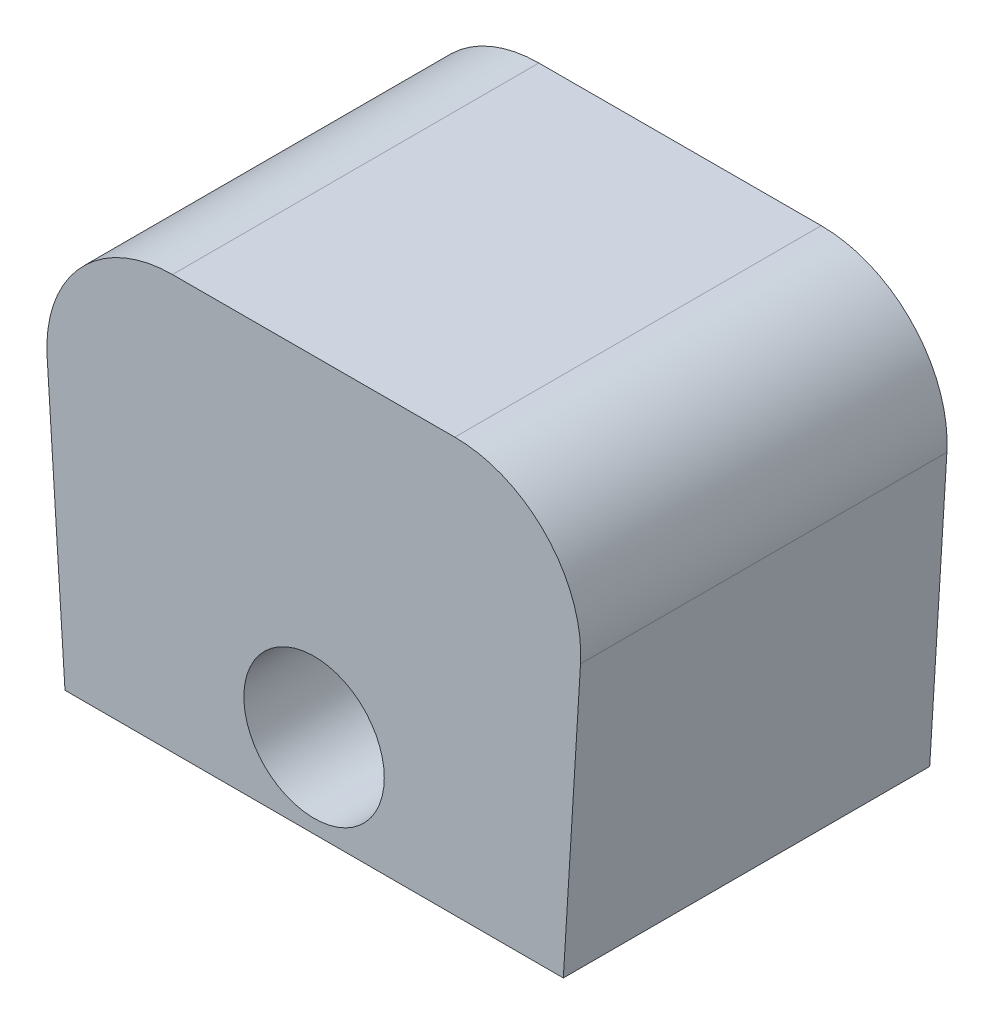
ISO-10303-21;
HEADER;
FILE_DESCRIPTION(('STEP AP214'),'2;1');
FILE_NAME('part.step','',(''),(''),'','','');
FILE_SCHEMA(('AUTOMOTIVE_DESIGN { 1 0 10303 214 1 1 1 1 }'));
ENDSEC;
DATA;
#1=APPLICATION_CONTEXT('core data for automotive mechanical design processes');
#2=APPLICATION_PROTOCOL_DEFINITION('international standard','automotive_design',2000,#1);
#3=PRODUCT_CONTEXT('',#1,'mechanical');
#4=PRODUCT('Part','Part','',(#3));
#5=PRODUCT_RELATED_PRODUCT_CATEGORY('part','',(#4));
#6=PRODUCT_DEFINITION_FORMATION('','',#4);
#7=PRODUCT_DEFINITION_CONTEXT('part definition',#1,'design');
#8=PRODUCT_DEFINITION('design','',#6,#7);
#9=PRODUCT_DEFINITION_SHAPE('','',#8);
#10=(LENGTH_UNIT() NAMED_UNIT(*) SI_UNIT(.MILLI.,.METRE.));
#11=(NAMED_UNIT(*) PLANE_ANGLE_UNIT() SI_UNIT($,.RADIAN.));
#12=(NAMED_UNIT(*) SI_UNIT($,.STERADIAN.) SOLID_ANGLE_UNIT());
#13=UNCERTAINTY_MEASURE_WITH_UNIT(LENGTH_MEASURE(1.E-05),#10,'distance_accuracy_value','');
#14=(GEOMETRIC_REPRESENTATION_CONTEXT(3) GLOBAL_UNCERTAINTY_ASSIGNED_CONTEXT((#13)) GLOBAL_UNIT_ASSIGNED_CONTEXT((#10,
#11,#12)) REPRESENTATION_CONTEXT('',''));
#15=CARTESIAN_POINT('',(0.,0.,0.));
#16=DIRECTION('',(0.,0.,1.));
#17=DIRECTION('',(1.,0.,0.));
#18=AXIS2_PLACEMENT_3D('',#15,#16,#17);
#19=CARTESIAN_POINT('',(-11.3824033916245,-170.017115375092,11.0998));
#20=DIRECTION('',(0.,0.,1.));
#21=DIRECTION('',(1.,0.,0.));
#22=AXIS2_PLACEMENT_3D('',#19,#20,#21);
#23=PLANE('',#22);
#24=DIRECTION('',(-1.,0.,0.));
#25=VECTOR('',#24,1.);
#26=CARTESIAN_POINT('',(-21.7956471497427,-150.96849439695,11.0998));
#27=LINE('',#26,#25);
#28=CARTESIAN_POINT('',(-3.85789011624694,-150.96849439695,11.0998));
#29=VERTEX_POINT('',#28);
#30=CARTESIAN_POINT('',(-18.9554243105865,-150.96849439695,11.0998));
#31=VERTEX_POINT('',#30);
#32=EDGE_CURVE('E55',#29,#31,#27,.T.);
#33=ORIENTED_EDGE('',*,*,#32,.F.);
#34=DIRECTION('',(0.0611381739078937,0.998129312109011,0.));
#35=VECTOR('',#34,1.);
#36=CARTESIAN_POINT('',(-5.03224485190564,-170.140769418459,11.0998));
#37=LINE('',#36,#35);
#38=CARTESIAN_POINT('',(-3.33703395668933,-142.465103356351,11.0998));
#39=VERTEX_POINT('',#38);
#40=EDGE_CURVE('E90',#29,#39,#37,.T.);
#41=ORIENTED_EDGE('',*,*,#40,.T.);
#42=CARTESIAN_POINT('',(-7.13990663582466,-142.232166913762,11.0998));
#43=DIRECTION('',(0.,0.,1.));
#44=DIRECTION('',(1.,0.,0.));
#45=AXIS2_PLACEMENT_3D('',#42,#43,#44);
#46=CIRCLE('',#45,3.81);
#47=CARTESIAN_POINT('',(-7.14464049886683,-138.422169854637,11.0998));
#48=VERTEX_POINT('',#47);
#49=EDGE_CURVE('E116',#39,#48,#46,.T.);
#50=ORIENTED_EDGE('',*,*,#49,.T.);
#51=DIRECTION('',(-0.999999228116782,-0.00124248373809783,0.));
#52=VECTOR('',#51,1.);
#53=CARTESIAN_POINT('',(-7.14464049886683,-138.422169854637,11.0998));
#54=LINE('',#53,#52);
#55=CARTESIAN_POINT('',(-15.6986655515832,-138.432798099864,11.0998));
#56=VERTEX_POINT('',#55);
#57=EDGE_CURVE('E121',#48,#56,#54,.T.);
#58=ORIENTED_EDGE('',*,*,#57,.T.);
#59=CARTESIAN_POINT('',(-15.6939316885411,-142.242795158989,11.0998));
#60=DIRECTION('',(0.,0.,1.));
#61=DIRECTION('',(1.,0.,0.));
#62=AXIS2_PLACEMENT_3D('',#59,#60,#61);
#63=CIRCLE('',#62,3.81);
#64=CARTESIAN_POINT('',(-19.4962137871495,-142.485180890009,11.0998));
#65=VERTEX_POINT('',#64);
#66=EDGE_CURVE('E63',#56,#65,#63,.T.);
#67=ORIENTED_EDGE('',*,*,#66,.T.);
#68=DIRECTION('',(0.0636183021049627,-0.997974304096695,0.));
#69=VECTOR('',#68,1.);
#70=CARTESIAN_POINT('',(-19.4962137871495,-142.485180890009,11.0998));
#71=LINE('',#70,#69);
#72=EDGE_CURVE('E110',#65,#31,#71,.T.);
#73=ORIENTED_EDGE('',*,*,#72,.T.);
#74=EDGE_LOOP('',(#33,#41,#50,#58,#67,#73));
#75=FACE_BOUND('',#74,.T.);
#76=CARTESIAN_POINT('',(-11.4092269228225,-148.42849439695,11.0998));
#77=DIRECTION('',(0.,0.,1.));
#78=DIRECTION('',(1.,0.,0.));
#79=AXIS2_PLACEMENT_3D('',#76,#77,#78);
#80=CIRCLE('',#79,2.127);
#81=CARTESIAN_POINT('',(-9.28222692282247,-148.42849439695,11.0998));
#82=VERTEX_POINT('',#81);
#83=EDGE_CURVE('E139',#82,#82,#80,.T.);
#84=ORIENTED_EDGE('',*,*,#83,.F.);
#85=EDGE_LOOP('',(#84));
#86=FACE_BOUND('',#85,.T.);
#87=ADVANCED_FACE('F39',(#75,#86),#23,.T.);
#88=CARTESIAN_POINT('',(-11.3824033916245,-170.017115375092,0.));
#89=DIRECTION('',(0.,0.,1.));
#90=DIRECTION('',(1.,0.,0.));
#91=AXIS2_PLACEMENT_3D('',#88,#89,#90);
#92=PLANE('',#91);
#93=DIRECTION('',(0.0611381739078937,0.998129312109011,0.));
#94=VECTOR('',#93,1.);
#95=CARTESIAN_POINT('',(-5.03224485190564,-170.140769418459,0.));
#96=LINE('',#95,#94);
#97=CARTESIAN_POINT('',(-3.85789011624694,-150.96849439695,0.));
#98=VERTEX_POINT('',#97);
#99=CARTESIAN_POINT('',(-3.33703395668933,-142.465103356351,0.));
#100=VERTEX_POINT('',#99);
#101=EDGE_CURVE('E135',#98,#100,#96,.T.);
#102=ORIENTED_EDGE('',*,*,#101,.F.);
#103=DIRECTION('',(-1.,0.,0.));
#104=VECTOR('',#103,1.);
#105=CARTESIAN_POINT('',(-21.7956471497427,-150.96849439695,0.));
#106=LINE('',#105,#104);
#107=CARTESIAN_POINT('',(-18.9554243105865,-150.96849439695,0.));
#108=VERTEX_POINT('',#107);
#109=EDGE_CURVE('E102',#98,#108,#106,.T.);
#110=ORIENTED_EDGE('',*,*,#109,.T.);
#111=DIRECTION('',(0.0636183021049627,-0.997974304096695,0.));
#112=VECTOR('',#111,1.);
#113=CARTESIAN_POINT('',(-19.4962137871495,-142.485180890009,0.));
#114=LINE('',#113,#112);
#115=CARTESIAN_POINT('',(-19.4962137871495,-142.485180890009,0.));
#116=VERTEX_POINT('',#115);
#117=EDGE_CURVE('E117',#116,#108,#114,.T.);
#118=ORIENTED_EDGE('',*,*,#117,.F.);
#119=CARTESIAN_POINT('',(-15.6939316885411,-142.242795158989,0.));
#120=DIRECTION('',(0.,0.,1.));
#121=DIRECTION('',(1.,0.,0.));
#122=AXIS2_PLACEMENT_3D('',#119,#120,#121);
#123=CIRCLE('',#122,3.81);
#124=CARTESIAN_POINT('',(-15.6986655515832,-138.432798099864,0.));
#125=VERTEX_POINT('',#124);
#126=EDGE_CURVE('E84',#125,#116,#123,.T.);
#127=ORIENTED_EDGE('',*,*,#126,.F.);
#128=DIRECTION('',(-0.999999228116782,-0.00124248373809783,0.));
#129=VECTOR('',#128,1.);
#130=CARTESIAN_POINT('',(-7.14464049886683,-138.422169854637,0.));
#131=LINE('',#130,#129);
#132=CARTESIAN_POINT('',(-7.14464049886683,-138.422169854637,0.));
#133=VERTEX_POINT('',#132);
#134=EDGE_CURVE('E142',#133,#125,#131,.T.);
#135=ORIENTED_EDGE('',*,*,#134,.F.);
#136=CARTESIAN_POINT('',(-7.13990663582466,-142.232166913762,0.));
#137=DIRECTION('',(0.,0.,1.));
#138=DIRECTION('',(1.,0.,0.));
#139=AXIS2_PLACEMENT_3D('',#136,#137,#138);
#140=CIRCLE('',#139,3.81);
#141=EDGE_CURVE('E138',#100,#133,#140,.T.);
#142=ORIENTED_EDGE('',*,*,#141,.F.);
#143=EDGE_LOOP('',(#102,#110,#118,#127,#135,#142));
#144=FACE_BOUND('',#143,.T.);
#145=CARTESIAN_POINT('',(-11.4092269228225,-148.42849439695,0.));
#146=DIRECTION('',(0.,0.,1.));
#147=DIRECTION('',(1.,0.,0.));
#148=AXIS2_PLACEMENT_3D('',#145,#146,#147);
#149=CIRCLE('',#148,2.127);
#150=CARTESIAN_POINT('',(-9.28222692282247,-148.42849439695,0.));
#151=VERTEX_POINT('',#150);
#152=EDGE_CURVE('E106',#151,#151,#149,.T.);
#153=ORIENTED_EDGE('',*,*,#152,.T.);
#154=EDGE_LOOP('',(#153));
#155=FACE_BOUND('',#154,.T.);
#156=ADVANCED_FACE('F162',(#144,#155),#92,.F.);
#157=CARTESIAN_POINT('',(-5.03224485190564,-170.140769418459,11.0998));
#158=DIRECTION('',(-0.998129312109011,0.0611381739078937,0.));
#159=DIRECTION('',(-0.0611381739078937,-0.998129312109011,0.));
#160=AXIS2_PLACEMENT_3D('',#157,#158,#159);
#161=PLANE('',#160);
#162=ORIENTED_EDGE('',*,*,#40,.F.);
#163=DIRECTION('',(0.,0.,-1.));
#164=VECTOR('',#163,1.);
#165=CARTESIAN_POINT('',(-3.85789011624693,-150.96849439695,11.0998));
#166=LINE('',#165,#164);
#167=EDGE_CURVE('E99',#29,#98,#166,.T.);
#168=ORIENTED_EDGE('',*,*,#167,.T.);
#169=ORIENTED_EDGE('',*,*,#101,.T.);
#170=DIRECTION('',(0.,0.,-1.));
#171=VECTOR('',#170,1.);
#172=CARTESIAN_POINT('',(-3.33703395668933,-142.465103356351,11.0998));
#173=LINE('',#172,#171);
#174=EDGE_CURVE('E48',#39,#100,#173,.T.);
#175=ORIENTED_EDGE('',*,*,#174,.F.);
#176=EDGE_LOOP('',(#162,#168,#169,#175));
#177=FACE_BOUND('',#176,.T.);
#178=ADVANCED_FACE('F41',(#177),#161,.F.);
#179=CARTESIAN_POINT('',(-7.13990663582466,-142.232166913762,11.0998));
#180=DIRECTION('',(0.,0.,-1.));
#181=DIRECTION('',(-1.,0.,0.));
#182=AXIS2_PLACEMENT_3D('',#179,#180,#181);
#183=CYLINDRICAL_SURFACE('',#182,3.81);
#184=ORIENTED_EDGE('',*,*,#141,.T.);
#185=DIRECTION('',(0.,0.,-1.));
#186=VECTOR('',#185,1.);
#187=CARTESIAN_POINT('',(-7.14464049886683,-138.422169854637,11.0998));
#188=LINE('',#187,#186);
#189=EDGE_CURVE('E152',#48,#133,#188,.T.);
#190=ORIENTED_EDGE('',*,*,#189,.F.);
#191=ORIENTED_EDGE('',*,*,#49,.F.);
#192=ORIENTED_EDGE('',*,*,#174,.T.);
#193=EDGE_LOOP('',(#184,#190,#191,#192));
#194=FACE_BOUND('',#193,.T.);
#195=ADVANCED_FACE('F158',(#194),#183,.T.);
#196=CARTESIAN_POINT('',(-7.14464049886683,-138.422169854637,11.0998));
#197=DIRECTION('',(0.00124248373809783,-0.999999228116782,0.));
#198=DIRECTION('',(0.999999228116783,0.00124248373809783,0.));
#199=AXIS2_PLACEMENT_3D('',#196,#197,#198);
#200=PLANE('',#199);
#201=ORIENTED_EDGE('',*,*,#134,.T.);
#202=DIRECTION('',(0.,0.,-1.));
#203=VECTOR('',#202,1.);
#204=CARTESIAN_POINT('',(-15.6986655515832,-138.432798099864,11.0998));
#205=LINE('',#204,#203);
#206=EDGE_CURVE('E149',#56,#125,#205,.T.);
#207=ORIENTED_EDGE('',*,*,#206,.F.);
#208=ORIENTED_EDGE('',*,*,#57,.F.);
#209=ORIENTED_EDGE('',*,*,#189,.T.);
#210=EDGE_LOOP('',(#201,#207,#208,#209));
#211=FACE_BOUND('',#210,.T.);
#212=ADVANCED_FACE('F167',(#211),#200,.F.);
#213=CARTESIAN_POINT('',(-15.6939316885411,-142.242795158989,11.0998));
#214=DIRECTION('',(0.,0.,-1.));
#215=DIRECTION('',(-1.,0.,0.));
#216=AXIS2_PLACEMENT_3D('',#213,#214,#215);
#217=CYLINDRICAL_SURFACE('',#216,3.81);
#218=ORIENTED_EDGE('',*,*,#126,.T.);
#219=DIRECTION('',(0.,0.,-1.));
#220=VECTOR('',#219,1.);
#221=CARTESIAN_POINT('',(-19.4962137871495,-142.485180890009,11.0998));
#222=LINE('',#221,#220);
#223=EDGE_CURVE('E134',#65,#116,#222,.T.);
#224=ORIENTED_EDGE('',*,*,#223,.F.);
#225=ORIENTED_EDGE('',*,*,#66,.F.);
#226=ORIENTED_EDGE('',*,*,#206,.T.);
#227=EDGE_LOOP('',(#218,#224,#225,#226));
#228=FACE_BOUND('',#227,.T.);
#229=ADVANCED_FACE('F169',(#228),#217,.T.);
#230=CARTESIAN_POINT('',(-19.4962137871495,-142.485180890009,11.0998));
#231=DIRECTION('',(0.997974304096695,0.0636183021049627,0.));
#232=DIRECTION('',(-0.0636183021049627,0.997974304096695,0.));
#233=AXIS2_PLACEMENT_3D('',#230,#231,#232);
#234=PLANE('',#233);
#235=ORIENTED_EDGE('',*,*,#117,.T.);
#236=DIRECTION('',(0.,0.,1.));
#237=VECTOR('',#236,1.);
#238=CARTESIAN_POINT('',(-18.9554243105865,-150.96849439695,11.0998));
#239=LINE('',#238,#237);
#240=EDGE_CURVE('E11',#108,#31,#239,.T.);
#241=ORIENTED_EDGE('',*,*,#240,.T.);
#242=ORIENTED_EDGE('',*,*,#72,.F.);
#243=ORIENTED_EDGE('',*,*,#223,.T.);
#244=EDGE_LOOP('',(#235,#241,#242,#243));
#245=FACE_BOUND('',#244,.T.);
#246=ADVANCED_FACE('F171',(#245),#234,.F.);
#247=CARTESIAN_POINT('',(-11.4092269228225,-148.42849439695,11.0998));
#248=DIRECTION('',(0.,0.,-1.));
#249=DIRECTION('',(-1.,0.,0.));
#250=AXIS2_PLACEMENT_3D('',#247,#248,#249);
#251=CYLINDRICAL_SURFACE('',#250,2.127);
#252=ORIENTED_EDGE('',*,*,#83,.T.);
#253=EDGE_LOOP('',(#252));
#254=FACE_BOUND('',#253,.T.);
#255=ORIENTED_EDGE('',*,*,#152,.F.);
#256=EDGE_LOOP('',(#255));
#257=FACE_BOUND('',#256,.T.);
#258=ADVANCED_FACE('F182',(#254,#257),#251,.F.);
#259=CARTESIAN_POINT('',(-21.7956471497427,-150.96849439695,0.));
#260=DIRECTION('',(0.,1.,0.));
#261=DIRECTION('',(0.,0.,1.));
#262=AXIS2_PLACEMENT_3D('',#259,#260,#261);
#263=PLANE('',#262);
#264=ORIENTED_EDGE('',*,*,#32,.T.);
#265=ORIENTED_EDGE('',*,*,#240,.F.);
#266=ORIENTED_EDGE('',*,*,#109,.F.);
#267=ORIENTED_EDGE('',*,*,#167,.F.);
#268=EDGE_LOOP('',(#264,#265,#266,#267));
#269=FACE_BOUND('',#268,.T.);
#270=ADVANCED_FACE('F100',(#269),#263,.F.);
#271=CLOSED_SHELL('',(#87,#156,#178,#195,#212,#229,#246,#258,#270));
#272=MANIFOLD_SOLID_BREP('B2',#271);
#273=ADVANCED_BREP_SHAPE_REPRESENTATION('',(#18,#272),#14);
#274=SHAPE_DEFINITION_REPRESENTATION(#9,#273);
ENDSEC;
END-ISO-10303-21;
